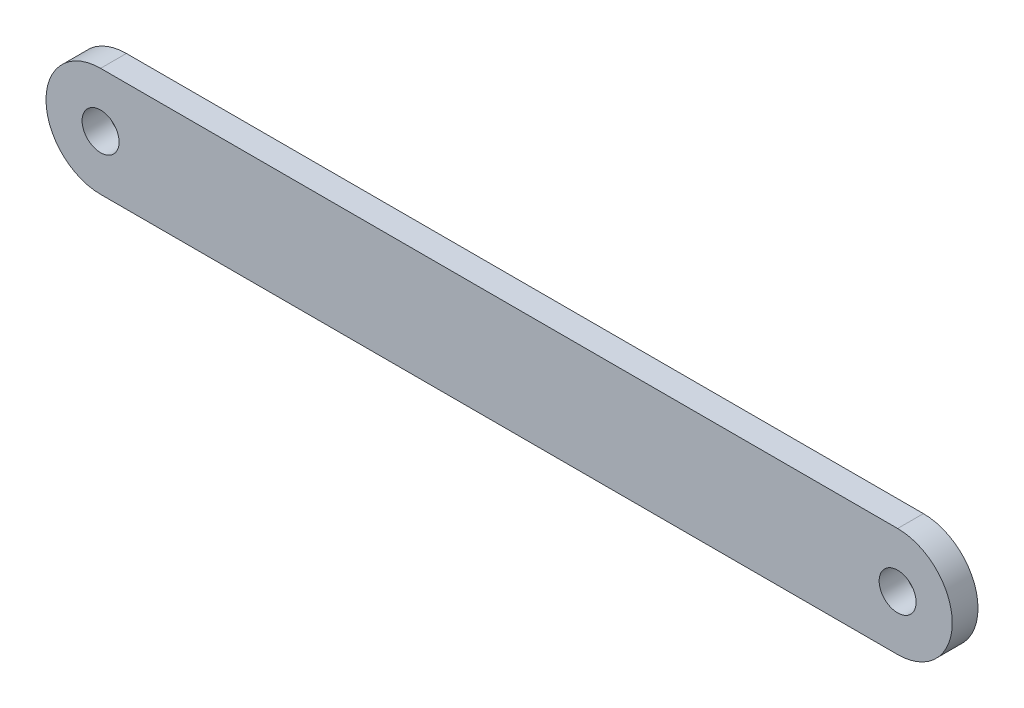
ISO-10303-21;
HEADER;
FILE_DESCRIPTION(('STEP AP214'),'2;1');
FILE_NAME('part.step','',(''),(''),'','','');
FILE_SCHEMA(('AUTOMOTIVE_DESIGN { 1 0 10303 214 1 1 1 1 }'));
ENDSEC;
DATA;
#1=APPLICATION_CONTEXT('core data for automotive mechanical design processes');
#2=APPLICATION_PROTOCOL_DEFINITION('international standard','automotive_design',2000,#1);
#3=PRODUCT_CONTEXT('',#1,'mechanical');
#4=PRODUCT('Part','Part','',(#3));
#5=PRODUCT_RELATED_PRODUCT_CATEGORY('part','',(#4));
#6=PRODUCT_DEFINITION_FORMATION('','',#4);
#7=PRODUCT_DEFINITION_CONTEXT('part definition',#1,'design');
#8=PRODUCT_DEFINITION('design','',#6,#7);
#9=PRODUCT_DEFINITION_SHAPE('','',#8);
#10=(LENGTH_UNIT() NAMED_UNIT(*) SI_UNIT(.MILLI.,.METRE.));
#11=(NAMED_UNIT(*) PLANE_ANGLE_UNIT() SI_UNIT($,.RADIAN.));
#12=(NAMED_UNIT(*) SI_UNIT($,.STERADIAN.) SOLID_ANGLE_UNIT());
#13=UNCERTAINTY_MEASURE_WITH_UNIT(LENGTH_MEASURE(1.E-05),#10,'distance_accuracy_value','');
#14=(GEOMETRIC_REPRESENTATION_CONTEXT(3) GLOBAL_UNCERTAINTY_ASSIGNED_CONTEXT((#13)) GLOBAL_UNIT_ASSIGNED_CONTEXT((#10,
#11,#12)) REPRESENTATION_CONTEXT('',''));
#15=CARTESIAN_POINT('',(0.,0.,0.));
#16=DIRECTION('',(0.,0.,1.));
#17=DIRECTION('',(1.,0.,0.));
#18=AXIS2_PLACEMENT_3D('',#15,#16,#17);
#19=CARTESIAN_POINT('',(-46.355,0.,2.9972));
#20=DIRECTION('',(0.,0.,-1.));
#21=DIRECTION('',(-1.,0.,0.));
#22=AXIS2_PLACEMENT_3D('',#19,#20,#21);
#23=CYLINDRICAL_SURFACE('',#22,6.35);
#24=CARTESIAN_POINT('',(-46.355,0.,0.));
#25=DIRECTION('',(0.,0.,1.));
#26=DIRECTION('',(1.,0.,0.));
#27=AXIS2_PLACEMENT_3D('',#24,#25,#26);
#28=CIRCLE('',#27,6.35);
#29=CARTESIAN_POINT('',(-46.355,6.35,0.));
#30=VERTEX_POINT('',#29);
#31=CARTESIAN_POINT('',(-46.355,-6.35,0.));
#32=VERTEX_POINT('',#31);
#33=EDGE_CURVE('E97',#30,#32,#28,.T.);
#34=ORIENTED_EDGE('',*,*,#33,.T.);
#35=DIRECTION('',(0.,0.,-1.));
#36=VECTOR('',#35,1.);
#37=CARTESIAN_POINT('',(-46.355,-6.35,2.9972));
#38=LINE('',#37,#36);
#39=CARTESIAN_POINT('',(-46.355,-6.35,2.9972));
#40=VERTEX_POINT('',#39);
#41=EDGE_CURVE('E11',#40,#32,#38,.T.);
#42=ORIENTED_EDGE('',*,*,#41,.F.);
#43=CARTESIAN_POINT('',(-46.355,0.,2.9972));
#44=DIRECTION('',(0.,0.,1.));
#45=DIRECTION('',(1.,0.,0.));
#46=AXIS2_PLACEMENT_3D('',#43,#44,#45);
#47=CIRCLE('',#46,6.35);
#48=CARTESIAN_POINT('',(-46.355,6.35,2.9972));
#49=VERTEX_POINT('',#48);
#50=EDGE_CURVE('E84',#49,#40,#47,.T.);
#51=ORIENTED_EDGE('',*,*,#50,.F.);
#52=DIRECTION('',(0.,0.,-1.));
#53=VECTOR('',#52,1.);
#54=CARTESIAN_POINT('',(-46.355,6.35,2.9972));
#55=LINE('',#54,#53);
#56=EDGE_CURVE('E93',#49,#30,#55,.T.);
#57=ORIENTED_EDGE('',*,*,#56,.T.);
#58=EDGE_LOOP('',(#34,#42,#51,#57));
#59=FACE_BOUND('',#58,.T.);
#60=ADVANCED_FACE('F32',(#59),#23,.T.);
#61=CARTESIAN_POINT('',(-46.355,-6.35,2.9972));
#62=DIRECTION('',(0.,1.,0.));
#63=DIRECTION('',(-1.,0.,0.));
#64=AXIS2_PLACEMENT_3D('',#61,#62,#63);
#65=PLANE('',#64);
#66=DIRECTION('',(1.,0.,0.));
#67=VECTOR('',#66,1.);
#68=CARTESIAN_POINT('',(-46.355,-6.35,0.));
#69=LINE('',#68,#67);
#70=CARTESIAN_POINT('',(46.355,-6.34999999999998,0.));
#71=VERTEX_POINT('',#70);
#72=EDGE_CURVE('E88',#32,#71,#69,.T.);
#73=ORIENTED_EDGE('',*,*,#72,.T.);
#74=DIRECTION('',(0.,0.,-1.));
#75=VECTOR('',#74,1.);
#76=CARTESIAN_POINT('',(46.355,-6.34999999999998,2.9972));
#77=LINE('',#76,#75);
#78=CARTESIAN_POINT('',(46.355,-6.34999999999998,2.9972));
#79=VERTEX_POINT('',#78);
#80=EDGE_CURVE('E41',#79,#71,#77,.T.);
#81=ORIENTED_EDGE('',*,*,#80,.F.);
#82=DIRECTION('',(1.,0.,0.));
#83=VECTOR('',#82,1.);
#84=CARTESIAN_POINT('',(-46.355,-6.35,2.9972));
#85=LINE('',#84,#83);
#86=EDGE_CURVE('E79',#40,#79,#85,.T.);
#87=ORIENTED_EDGE('',*,*,#86,.F.);
#88=ORIENTED_EDGE('',*,*,#41,.T.);
#89=EDGE_LOOP('',(#73,#81,#87,#88));
#90=FACE_BOUND('',#89,.T.);
#91=ADVANCED_FACE('F87',(#90),#65,.F.);
#92=CARTESIAN_POINT('',(46.355,0.,2.9972));
#93=DIRECTION('',(0.,0.,-1.));
#94=DIRECTION('',(-1.,0.,0.));
#95=AXIS2_PLACEMENT_3D('',#92,#93,#94);
#96=CYLINDRICAL_SURFACE('',#95,6.35);
#97=CARTESIAN_POINT('',(46.355,0.,0.));
#98=DIRECTION('',(0.,0.,1.));
#99=DIRECTION('',(1.,0.,0.));
#100=AXIS2_PLACEMENT_3D('',#97,#98,#99);
#101=CIRCLE('',#100,6.35);
#102=CARTESIAN_POINT('',(46.355,6.35000000000002,0.));
#103=VERTEX_POINT('',#102);
#104=EDGE_CURVE('E66',#71,#103,#101,.T.);
#105=ORIENTED_EDGE('',*,*,#104,.T.);
#106=DIRECTION('',(0.,0.,-1.));
#107=VECTOR('',#106,1.);
#108=CARTESIAN_POINT('',(46.355,6.35000000000002,2.9972));
#109=LINE('',#108,#107);
#110=CARTESIAN_POINT('',(46.355,6.35000000000002,2.9972));
#111=VERTEX_POINT('',#110);
#112=EDGE_CURVE('E89',#111,#103,#109,.T.);
#113=ORIENTED_EDGE('',*,*,#112,.F.);
#114=CARTESIAN_POINT('',(46.355,0.,2.9972));
#115=DIRECTION('',(0.,0.,1.));
#116=DIRECTION('',(1.,0.,0.));
#117=AXIS2_PLACEMENT_3D('',#114,#115,#116);
#118=CIRCLE('',#117,6.35);
#119=EDGE_CURVE('E82',#79,#111,#118,.T.);
#120=ORIENTED_EDGE('',*,*,#119,.F.);
#121=ORIENTED_EDGE('',*,*,#80,.T.);
#122=EDGE_LOOP('',(#105,#113,#120,#121));
#123=FACE_BOUND('',#122,.T.);
#124=ADVANCED_FACE('F91',(#123),#96,.T.);
#125=CARTESIAN_POINT('',(-46.355,6.35,2.9972));
#126=DIRECTION('',(0.,-1.,0.));
#127=DIRECTION('',(1.,0.,0.));
#128=AXIS2_PLACEMENT_3D('',#125,#126,#127);
#129=PLANE('',#128);
#130=DIRECTION('',(-1.,0.,0.));
#131=VECTOR('',#130,1.);
#132=CARTESIAN_POINT('',(-46.355,6.35,0.));
#133=LINE('',#132,#131);
#134=EDGE_CURVE('E72',#103,#30,#133,.T.);
#135=ORIENTED_EDGE('',*,*,#134,.T.);
#136=ORIENTED_EDGE('',*,*,#56,.F.);
#137=DIRECTION('',(-1.,0.,0.));
#138=VECTOR('',#137,1.);
#139=CARTESIAN_POINT('',(-46.355,6.35,2.9972));
#140=LINE('',#139,#138);
#141=EDGE_CURVE('E49',#111,#49,#140,.T.);
#142=ORIENTED_EDGE('',*,*,#141,.F.);
#143=ORIENTED_EDGE('',*,*,#112,.T.);
#144=EDGE_LOOP('',(#135,#136,#142,#143));
#145=FACE_BOUND('',#144,.T.);
#146=ADVANCED_FACE('F105',(#145),#129,.F.);
#147=CARTESIAN_POINT('',(-46.355,0.,2.9972));
#148=DIRECTION('',(0.,0.,1.));
#149=DIRECTION('',(1.,0.,0.));
#150=AXIS2_PLACEMENT_3D('',#147,#148,#149);
#151=PLANE('',#150);
#152=CARTESIAN_POINT('',(-46.355,0.,2.9972));
#153=DIRECTION('',(0.,0.,1.));
#154=DIRECTION('',(1.,0.,0.));
#155=AXIS2_PLACEMENT_3D('',#152,#153,#154);
#156=CIRCLE('',#155,2.15264999999999);
#157=CARTESIAN_POINT('',(-44.20235,0.,2.9972));
#158=VERTEX_POINT('',#157);
#159=EDGE_CURVE('E116',#158,#158,#156,.T.);
#160=ORIENTED_EDGE('',*,*,#159,.F.);
#161=EDGE_LOOP('',(#160));
#162=FACE_BOUND('',#161,.T.);
#163=CARTESIAN_POINT('',(46.355,0.,2.9972));
#164=DIRECTION('',(0.,0.,1.));
#165=DIRECTION('',(1.,0.,0.));
#166=AXIS2_PLACEMENT_3D('',#163,#164,#165);
#167=CIRCLE('',#166,2.15264999999999);
#168=CARTESIAN_POINT('',(48.50765,0.,2.9972));
#169=VERTEX_POINT('',#168);
#170=EDGE_CURVE('E113',#169,#169,#167,.T.);
#171=ORIENTED_EDGE('',*,*,#170,.F.);
#172=EDGE_LOOP('',(#171));
#173=FACE_BOUND('',#172,.T.);
#174=ORIENTED_EDGE('',*,*,#50,.T.);
#175=ORIENTED_EDGE('',*,*,#86,.T.);
#176=ORIENTED_EDGE('',*,*,#119,.T.);
#177=ORIENTED_EDGE('',*,*,#141,.T.);
#178=EDGE_LOOP('',(#174,#175,#176,#177));
#179=FACE_BOUND('',#178,.T.);
#180=ADVANCED_FACE('F80',(#162,#173,#179),#151,.T.);
#181=CARTESIAN_POINT('',(-46.355,0.,0.));
#182=DIRECTION('',(0.,0.,1.));
#183=DIRECTION('',(1.,0.,0.));
#184=AXIS2_PLACEMENT_3D('',#181,#182,#183);
#185=PLANE('',#184);
#186=CARTESIAN_POINT('',(-46.355,0.,0.));
#187=DIRECTION('',(0.,0.,1.));
#188=DIRECTION('',(1.,0.,0.));
#189=AXIS2_PLACEMENT_3D('',#186,#187,#188);
#190=CIRCLE('',#189,2.15264999999999);
#191=CARTESIAN_POINT('',(-44.20235,0.,0.));
#192=VERTEX_POINT('',#191);
#193=EDGE_CURVE('E35',#192,#192,#190,.T.);
#194=ORIENTED_EDGE('',*,*,#193,.T.);
#195=EDGE_LOOP('',(#194));
#196=FACE_BOUND('',#195,.T.);
#197=CARTESIAN_POINT('',(46.355,0.,0.));
#198=DIRECTION('',(0.,0.,1.));
#199=DIRECTION('',(1.,0.,0.));
#200=AXIS2_PLACEMENT_3D('',#197,#198,#199);
#201=CIRCLE('',#200,2.15264999999999);
#202=CARTESIAN_POINT('',(48.50765,0.,0.));
#203=VERTEX_POINT('',#202);
#204=EDGE_CURVE('E100',#203,#203,#201,.T.);
#205=ORIENTED_EDGE('',*,*,#204,.T.);
#206=EDGE_LOOP('',(#205));
#207=FACE_BOUND('',#206,.T.);
#208=ORIENTED_EDGE('',*,*,#33,.F.);
#209=ORIENTED_EDGE('',*,*,#134,.F.);
#210=ORIENTED_EDGE('',*,*,#104,.F.);
#211=ORIENTED_EDGE('',*,*,#72,.F.);
#212=EDGE_LOOP('',(#208,#209,#210,#211));
#213=FACE_BOUND('',#212,.T.);
#214=ADVANCED_FACE('F108',(#196,#207,#213),#185,.F.);
#215=CARTESIAN_POINT('',(46.355,0.,2.9972));
#216=DIRECTION('',(0.,0.,1.));
#217=DIRECTION('',(1.,0.,0.));
#218=AXIS2_PLACEMENT_3D('',#215,#216,#217);
#219=CYLINDRICAL_SURFACE('',#218,2.15264999999999);
#220=ORIENTED_EDGE('',*,*,#170,.T.);
#221=EDGE_LOOP('',(#220));
#222=FACE_BOUND('',#221,.T.);
#223=ORIENTED_EDGE('',*,*,#204,.F.);
#224=EDGE_LOOP('',(#223));
#225=FACE_BOUND('',#224,.T.);
#226=ADVANCED_FACE('F127',(#222,#225),#219,.F.);
#227=CARTESIAN_POINT('',(-46.355,0.,2.9972));
#228=DIRECTION('',(0.,0.,1.));
#229=DIRECTION('',(1.,0.,0.));
#230=AXIS2_PLACEMENT_3D('',#227,#228,#229);
#231=CYLINDRICAL_SURFACE('',#230,2.15264999999999);
#232=ORIENTED_EDGE('',*,*,#159,.T.);
#233=EDGE_LOOP('',(#232));
#234=FACE_BOUND('',#233,.T.);
#235=ORIENTED_EDGE('',*,*,#193,.F.);
#236=EDGE_LOOP('',(#235));
#237=FACE_BOUND('',#236,.T.);
#238=ADVANCED_FACE('F125',(#234,#237),#231,.F.);
#239=CLOSED_SHELL('',(#60,#91,#124,#146,#180,#214,#226,#238));
#240=MANIFOLD_SOLID_BREP('B2',#239);
#241=ADVANCED_BREP_SHAPE_REPRESENTATION('',(#18,#240),#14);
#242=SHAPE_DEFINITION_REPRESENTATION(#9,#241);
ENDSEC;
END-ISO-10303-21;
